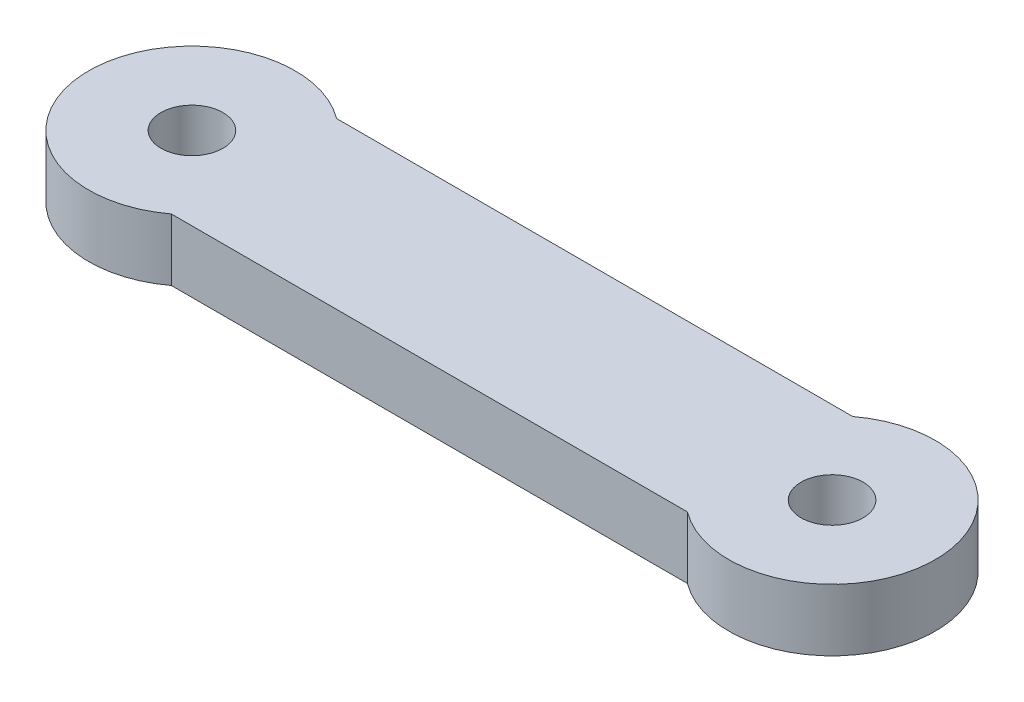
ISO-10303-21;
HEADER;
FILE_DESCRIPTION(('STEP AP214'),'2;1');
FILE_NAME('part.step','',(''),(''),'','','');
FILE_SCHEMA(('AUTOMOTIVE_DESIGN { 1 0 10303 214 1 1 1 1 }'));
ENDSEC;
DATA;
#1=APPLICATION_CONTEXT('core data for automotive mechanical design processes');
#2=APPLICATION_PROTOCOL_DEFINITION('international standard','automotive_design',2000,#1);
#3=PRODUCT_CONTEXT('',#1,'mechanical');
#4=PRODUCT('Part','Part','',(#3));
#5=PRODUCT_RELATED_PRODUCT_CATEGORY('part','',(#4));
#6=PRODUCT_DEFINITION_FORMATION('','',#4);
#7=PRODUCT_DEFINITION_CONTEXT('part definition',#1,'design');
#8=PRODUCT_DEFINITION('design','',#6,#7);
#9=PRODUCT_DEFINITION_SHAPE('','',#8);
#10=(LENGTH_UNIT() NAMED_UNIT(*) SI_UNIT(.MILLI.,.METRE.));
#11=(NAMED_UNIT(*) PLANE_ANGLE_UNIT() SI_UNIT($,.RADIAN.));
#12=(NAMED_UNIT(*) SI_UNIT($,.STERADIAN.) SOLID_ANGLE_UNIT());
#13=UNCERTAINTY_MEASURE_WITH_UNIT(LENGTH_MEASURE(1.E-05),#10,'distance_accuracy_value','');
#14=(GEOMETRIC_REPRESENTATION_CONTEXT(3) GLOBAL_UNCERTAINTY_ASSIGNED_CONTEXT((#13)) GLOBAL_UNIT_ASSIGNED_CONTEXT((#10,
#11,#12)) REPRESENTATION_CONTEXT('',''));
#15=CARTESIAN_POINT('',(0.,0.,0.));
#16=DIRECTION('',(0.,0.,1.));
#17=DIRECTION('',(1.,0.,0.));
#18=AXIS2_PLACEMENT_3D('',#15,#16,#17);
#19=CARTESIAN_POINT('',(15.4902,3.,0.));
#20=DIRECTION('',(0.,-1.,0.));
#21=DIRECTION('',(0.,0.,-1.));
#22=AXIS2_PLACEMENT_3D('',#19,#20,#21);
#23=PLANE('',#22);
#24=CARTESIAN_POINT('',(15.4902,3.,0.));
#25=DIRECTION('',(0.,1.,0.));
#26=DIRECTION('',(0.,0.,-1.));
#27=AXIS2_PLACEMENT_3D('',#24,#25,#26);
#28=CIRCLE('',#27,5.);
#29=CARTESIAN_POINT('',(12.4902,3.,4.));
#30=VERTEX_POINT('',#29);
#31=CARTESIAN_POINT('',(12.4902,3.,-4.));
#32=VERTEX_POINT('',#31);
#33=EDGE_CURVE('E90',#30,#32,#28,.T.);
#34=ORIENTED_EDGE('',*,*,#33,.T.);
#35=DIRECTION('',(-1.,0.,0.));
#36=VECTOR('',#35,1.);
#37=CARTESIAN_POINT('',(-12.4902,3.,-4.));
#38=LINE('',#37,#36);
#39=CARTESIAN_POINT('',(-12.4902,3.,-4.));
#40=VERTEX_POINT('',#39);
#41=EDGE_CURVE('E85',#32,#40,#38,.T.);
#42=ORIENTED_EDGE('',*,*,#41,.T.);
#43=CARTESIAN_POINT('',(-15.4902,3.,0.));
#44=DIRECTION('',(0.,1.,0.));
#45=DIRECTION('',(0.,0.,1.));
#46=AXIS2_PLACEMENT_3D('',#43,#44,#45);
#47=CIRCLE('',#46,5.);
#48=CARTESIAN_POINT('',(-12.4902,3.,4.));
#49=VERTEX_POINT('',#48);
#50=EDGE_CURVE('E88',#40,#49,#47,.T.);
#51=ORIENTED_EDGE('',*,*,#50,.T.);
#52=DIRECTION('',(1.,0.,0.));
#53=VECTOR('',#52,1.);
#54=CARTESIAN_POINT('',(12.4902,3.,4.));
#55=LINE('',#54,#53);
#56=EDGE_CURVE('E55',#49,#30,#55,.T.);
#57=ORIENTED_EDGE('',*,*,#56,.T.);
#58=EDGE_LOOP('',(#34,#42,#51,#57));
#59=FACE_BOUND('',#58,.T.);
#60=CARTESIAN_POINT('',(-15.4902,3.,0.));
#61=DIRECTION('',(0.,1.,0.));
#62=DIRECTION('',(0.,0.,1.));
#63=AXIS2_PLACEMENT_3D('',#60,#61,#62);
#64=CIRCLE('',#63,1.5);
#65=CARTESIAN_POINT('',(-15.4902,3.,1.5));
#66=VERTEX_POINT('',#65);
#67=EDGE_CURVE('E105',#66,#66,#64,.T.);
#68=ORIENTED_EDGE('',*,*,#67,.F.);
#69=EDGE_LOOP('',(#68));
#70=FACE_BOUND('',#69,.T.);
#71=CARTESIAN_POINT('',(15.4902,3.,0.));
#72=DIRECTION('',(0.,1.,0.));
#73=DIRECTION('',(0.,0.,-1.));
#74=AXIS2_PLACEMENT_3D('',#71,#72,#73);
#75=CIRCLE('',#74,1.5);
#76=CARTESIAN_POINT('',(15.4902,3.,-1.5));
#77=VERTEX_POINT('',#76);
#78=EDGE_CURVE('E120',#77,#77,#75,.T.);
#79=ORIENTED_EDGE('',*,*,#78,.F.);
#80=EDGE_LOOP('',(#79));
#81=FACE_BOUND('',#80,.T.);
#82=ADVANCED_FACE('F38',(#59,#70,#81),#23,.F.);
#83=CARTESIAN_POINT('',(15.4902,0.,0.));
#84=DIRECTION('',(0.,-1.,0.));
#85=DIRECTION('',(0.,0.,-1.));
#86=AXIS2_PLACEMENT_3D('',#83,#84,#85);
#87=PLANE('',#86);
#88=CARTESIAN_POINT('',(-15.4902,0.,0.));
#89=DIRECTION('',(0.,1.,0.));
#90=DIRECTION('',(0.,0.,1.));
#91=AXIS2_PLACEMENT_3D('',#88,#89,#90);
#92=CIRCLE('',#91,1.5);
#93=CARTESIAN_POINT('',(-15.4902,0.,1.5));
#94=VERTEX_POINT('',#93);
#95=EDGE_CURVE('E117',#94,#94,#92,.T.);
#96=ORIENTED_EDGE('',*,*,#95,.T.);
#97=EDGE_LOOP('',(#96));
#98=FACE_BOUND('',#97,.T.);
#99=CARTESIAN_POINT('',(15.4902,0.,0.));
#100=DIRECTION('',(0.,1.,0.));
#101=DIRECTION('',(0.,0.,-1.));
#102=AXIS2_PLACEMENT_3D('',#99,#100,#101);
#103=CIRCLE('',#102,5.);
#104=CARTESIAN_POINT('',(12.4902,0.,4.));
#105=VERTEX_POINT('',#104);
#106=CARTESIAN_POINT('',(12.4902,0.,-4.));
#107=VERTEX_POINT('',#106);
#108=EDGE_CURVE('E102',#105,#107,#103,.T.);
#109=ORIENTED_EDGE('',*,*,#108,.F.);
#110=DIRECTION('',(1.,0.,0.));
#111=VECTOR('',#110,1.);
#112=CARTESIAN_POINT('',(12.4902,0.,4.));
#113=LINE('',#112,#111);
#114=CARTESIAN_POINT('',(-12.4902,0.,4.));
#115=VERTEX_POINT('',#114);
#116=EDGE_CURVE('E78',#115,#105,#113,.T.);
#117=ORIENTED_EDGE('',*,*,#116,.F.);
#118=CARTESIAN_POINT('',(-15.4902,0.,0.));
#119=DIRECTION('',(0.,1.,0.));
#120=DIRECTION('',(0.,0.,1.));
#121=AXIS2_PLACEMENT_3D('',#118,#119,#120);
#122=CIRCLE('',#121,5.);
#123=CARTESIAN_POINT('',(-12.4902,0.,-4.));
#124=VERTEX_POINT('',#123);
#125=EDGE_CURVE('E72',#124,#115,#122,.T.);
#126=ORIENTED_EDGE('',*,*,#125,.F.);
#127=DIRECTION('',(-1.,0.,0.));
#128=VECTOR('',#127,1.);
#129=CARTESIAN_POINT('',(-12.4902,0.,-4.));
#130=LINE('',#129,#128);
#131=EDGE_CURVE('E94',#107,#124,#130,.T.);
#132=ORIENTED_EDGE('',*,*,#131,.F.);
#133=EDGE_LOOP('',(#109,#117,#126,#132));
#134=FACE_BOUND('',#133,.T.);
#135=CARTESIAN_POINT('',(15.4902,0.,0.));
#136=DIRECTION('',(0.,1.,0.));
#137=DIRECTION('',(0.,0.,-1.));
#138=AXIS2_PLACEMENT_3D('',#135,#136,#137);
#139=CIRCLE('',#138,1.5);
#140=CARTESIAN_POINT('',(15.4902,0.,-1.5));
#141=VERTEX_POINT('',#140);
#142=EDGE_CURVE('E123',#141,#141,#139,.T.);
#143=ORIENTED_EDGE('',*,*,#142,.T.);
#144=EDGE_LOOP('',(#143));
#145=FACE_BOUND('',#144,.T.);
#146=ADVANCED_FACE('F113',(#98,#134,#145),#87,.T.);
#147=CARTESIAN_POINT('',(15.4902,3.,0.));
#148=DIRECTION('',(0.,-1.,0.));
#149=DIRECTION('',(0.,0.,-1.));
#150=AXIS2_PLACEMENT_3D('',#147,#148,#149);
#151=CYLINDRICAL_SURFACE('',#150,5.);
#152=ORIENTED_EDGE('',*,*,#108,.T.);
#153=DIRECTION('',(0.,-1.,0.));
#154=VECTOR('',#153,1.);
#155=CARTESIAN_POINT('',(12.4902,3.,-4.));
#156=LINE('',#155,#154);
#157=EDGE_CURVE('E11',#32,#107,#156,.T.);
#158=ORIENTED_EDGE('',*,*,#157,.F.);
#159=ORIENTED_EDGE('',*,*,#33,.F.);
#160=DIRECTION('',(0.,-1.,0.));
#161=VECTOR('',#160,1.);
#162=CARTESIAN_POINT('',(12.4902,3.,4.));
#163=LINE('',#162,#161);
#164=EDGE_CURVE('E98',#30,#105,#163,.T.);
#165=ORIENTED_EDGE('',*,*,#164,.T.);
#166=EDGE_LOOP('',(#152,#158,#159,#165));
#167=FACE_BOUND('',#166,.T.);
#168=ADVANCED_FACE('F40',(#167),#151,.T.);
#169=CARTESIAN_POINT('',(-12.4902,3.,-4.));
#170=DIRECTION('',(0.,0.,1.));
#171=DIRECTION('',(1.,0.,0.));
#172=AXIS2_PLACEMENT_3D('',#169,#170,#171);
#173=PLANE('',#172);
#174=ORIENTED_EDGE('',*,*,#131,.T.);
#175=DIRECTION('',(0.,-1.,0.));
#176=VECTOR('',#175,1.);
#177=CARTESIAN_POINT('',(-12.4902,3.,-4.));
#178=LINE('',#177,#176);
#179=EDGE_CURVE('E47',#40,#124,#178,.T.);
#180=ORIENTED_EDGE('',*,*,#179,.F.);
#181=ORIENTED_EDGE('',*,*,#41,.F.);
#182=ORIENTED_EDGE('',*,*,#157,.T.);
#183=EDGE_LOOP('',(#174,#180,#181,#182));
#184=FACE_BOUND('',#183,.T.);
#185=ADVANCED_FACE('F93',(#184),#173,.F.);
#186=CARTESIAN_POINT('',(-15.4902,3.,0.));
#187=DIRECTION('',(0.,-1.,0.));
#188=DIRECTION('',(0.,0.,-1.));
#189=AXIS2_PLACEMENT_3D('',#186,#187,#188);
#190=CYLINDRICAL_SURFACE('',#189,5.);
#191=ORIENTED_EDGE('',*,*,#125,.T.);
#192=DIRECTION('',(0.,-1.,0.));
#193=VECTOR('',#192,1.);
#194=CARTESIAN_POINT('',(-12.4902,3.,4.));
#195=LINE('',#194,#193);
#196=EDGE_CURVE('E95',#49,#115,#195,.T.);
#197=ORIENTED_EDGE('',*,*,#196,.F.);
#198=ORIENTED_EDGE('',*,*,#50,.F.);
#199=ORIENTED_EDGE('',*,*,#179,.T.);
#200=EDGE_LOOP('',(#191,#197,#198,#199));
#201=FACE_BOUND('',#200,.T.);
#202=ADVANCED_FACE('F96',(#201),#190,.T.);
#203=CARTESIAN_POINT('',(12.4902,3.,4.));
#204=DIRECTION('',(0.,0.,-1.));
#205=DIRECTION('',(-1.,0.,0.));
#206=AXIS2_PLACEMENT_3D('',#203,#204,#205);
#207=PLANE('',#206);
#208=ORIENTED_EDGE('',*,*,#116,.T.);
#209=ORIENTED_EDGE('',*,*,#164,.F.);
#210=ORIENTED_EDGE('',*,*,#56,.F.);
#211=ORIENTED_EDGE('',*,*,#196,.T.);
#212=EDGE_LOOP('',(#208,#209,#210,#211));
#213=FACE_BOUND('',#212,.T.);
#214=ADVANCED_FACE('F110',(#213),#207,.F.);
#215=CARTESIAN_POINT('',(-15.4902,3.,0.));
#216=DIRECTION('',(0.,-1.,0.));
#217=DIRECTION('',(0.,0.,-1.));
#218=AXIS2_PLACEMENT_3D('',#215,#216,#217);
#219=CYLINDRICAL_SURFACE('',#218,1.5);
#220=ORIENTED_EDGE('',*,*,#67,.T.);
#221=EDGE_LOOP('',(#220));
#222=FACE_BOUND('',#221,.T.);
#223=ORIENTED_EDGE('',*,*,#95,.F.);
#224=EDGE_LOOP('',(#223));
#225=FACE_BOUND('',#224,.T.);
#226=ADVANCED_FACE('F140',(#222,#225),#219,.F.);
#227=CARTESIAN_POINT('',(15.4902,3.,0.));
#228=DIRECTION('',(0.,-1.,0.));
#229=DIRECTION('',(0.,0.,-1.));
#230=AXIS2_PLACEMENT_3D('',#227,#228,#229);
#231=CYLINDRICAL_SURFACE('',#230,1.5);
#232=ORIENTED_EDGE('',*,*,#78,.T.);
#233=EDGE_LOOP('',(#232));
#234=FACE_BOUND('',#233,.T.);
#235=ORIENTED_EDGE('',*,*,#142,.F.);
#236=EDGE_LOOP('',(#235));
#237=FACE_BOUND('',#236,.T.);
#238=ADVANCED_FACE('F129',(#234,#237),#231,.F.);
#239=CLOSED_SHELL('',(#82,#146,#168,#185,#202,#214,#226,#238));
#240=MANIFOLD_SOLID_BREP('B2',#239);
#241=ADVANCED_BREP_SHAPE_REPRESENTATION('',(#18,#240),#14);
#242=SHAPE_DEFINITION_REPRESENTATION(#9,#241);
ENDSEC;
END-ISO-10303-21;
